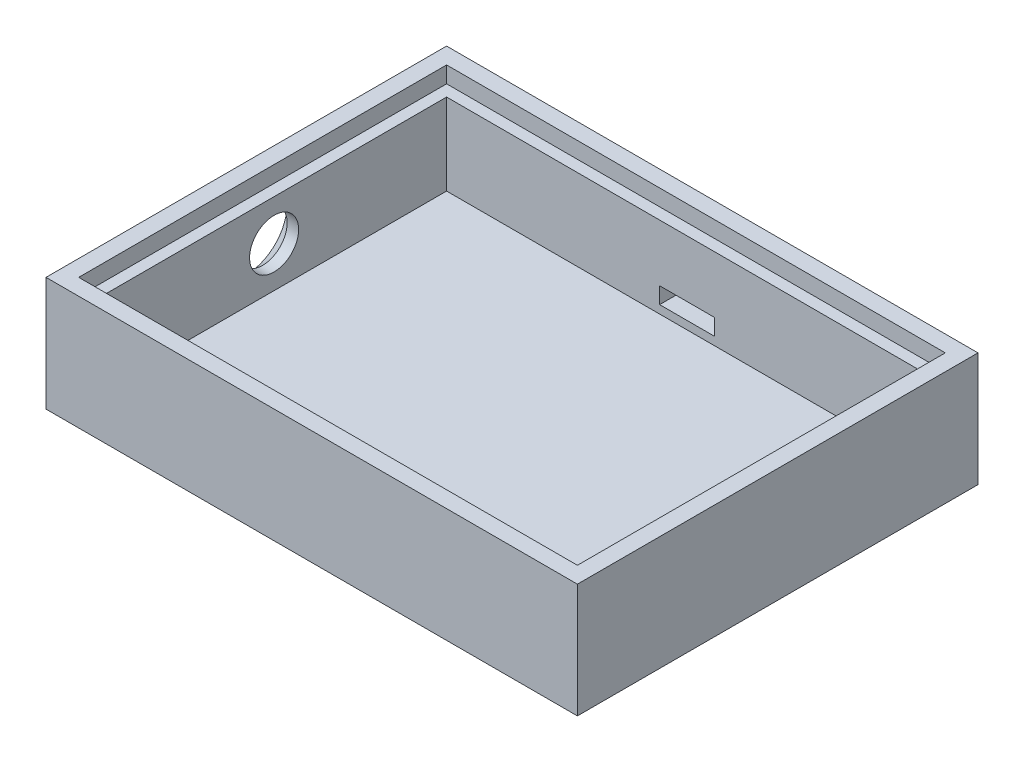
ISO-10303-21;
HEADER;
FILE_DESCRIPTION(('STEP AP214'),'2;1');
FILE_NAME('part.step','',(''),(''),'','','');
FILE_SCHEMA(('AUTOMOTIVE_DESIGN { 1 0 10303 214 1 1 1 1 }'));
ENDSEC;
DATA;
#1=APPLICATION_CONTEXT('core data for automotive mechanical design processes');
#2=APPLICATION_PROTOCOL_DEFINITION('international standard','automotive_design',2000,#1);
#3=PRODUCT_CONTEXT('',#1,'mechanical');
#4=PRODUCT('Part','Part','',(#3));
#5=PRODUCT_RELATED_PRODUCT_CATEGORY('part','',(#4));
#6=PRODUCT_DEFINITION_FORMATION('','',#4);
#7=PRODUCT_DEFINITION_CONTEXT('part definition',#1,'design');
#8=PRODUCT_DEFINITION('design','',#6,#7);
#9=PRODUCT_DEFINITION_SHAPE('','',#8);
#10=(LENGTH_UNIT() NAMED_UNIT(*) SI_UNIT(.MILLI.,.METRE.));
#11=(NAMED_UNIT(*) PLANE_ANGLE_UNIT() SI_UNIT($,.RADIAN.));
#12=(NAMED_UNIT(*) SI_UNIT($,.STERADIAN.) SOLID_ANGLE_UNIT());
#13=UNCERTAINTY_MEASURE_WITH_UNIT(LENGTH_MEASURE(1.E-05),#10,'distance_accuracy_value','');
#14=(GEOMETRIC_REPRESENTATION_CONTEXT(3) GLOBAL_UNCERTAINTY_ASSIGNED_CONTEXT((#13)) GLOBAL_UNIT_ASSIGNED_CONTEXT((#10,
#11,#12)) REPRESENTATION_CONTEXT('',''));
#15=CARTESIAN_POINT('',(0.,0.,0.));
#16=DIRECTION('',(0.,0.,1.));
#17=DIRECTION('',(1.,0.,0.));
#18=AXIS2_PLACEMENT_3D('',#15,#16,#17);
#19=CARTESIAN_POINT('',(-10.5,25.,-122.5));
#20=DIRECTION('',(-1.,0.,0.));
#21=DIRECTION('',(0.,-1.,0.));
#22=AXIS2_PLACEMENT_3D('',#19,#20,#21);
#23=PLANE('',#22);
#24=DIRECTION('',(0.,1.,0.));
#25=VECTOR('',#24,1.);
#26=CARTESIAN_POINT('',(-10.5,25.,-115.5));
#27=LINE('',#26,#25);
#28=CARTESIAN_POINT('',(-10.5,15.,-115.5));
#29=VERTEX_POINT('',#28);
#30=CARTESIAN_POINT('',(-10.5,25.,-115.5));
#31=VERTEX_POINT('',#30);
#32=EDGE_CURVE('E217',#29,#31,#27,.T.);
#33=ORIENTED_EDGE('',*,*,#32,.F.);
#34=DIRECTION('',(0.,0.,1.));
#35=VECTOR('',#34,1.);
#36=CARTESIAN_POINT('',(-10.5,15.,-122.5));
#37=LINE('',#36,#35);
#38=CARTESIAN_POINT('',(-10.5,15.,-122.5));
#39=VERTEX_POINT('',#38);
#40=EDGE_CURVE('E192',#39,#29,#37,.T.);
#41=ORIENTED_EDGE('',*,*,#40,.F.);
#42=DIRECTION('',(0.,-1.,0.));
#43=VECTOR('',#42,1.);
#44=CARTESIAN_POINT('',(-10.5,25.,-122.5));
#45=LINE('',#44,#43);
#46=CARTESIAN_POINT('',(-10.5,25.,-122.5));
#47=VERTEX_POINT('',#46);
#48=EDGE_CURVE('E220',#47,#39,#45,.T.);
#49=ORIENTED_EDGE('',*,*,#48,.F.);
#50=DIRECTION('',(0.,0.,1.));
#51=VECTOR('',#50,1.);
#52=CARTESIAN_POINT('',(-10.5,25.,-122.5));
#53=LINE('',#52,#51);
#54=EDGE_CURVE('E238',#47,#31,#53,.T.);
#55=ORIENTED_EDGE('',*,*,#54,.T.);
#56=EDGE_LOOP('',(#33,#41,#49,#55));
#57=FACE_BOUND('',#56,.T.);
#58=ADVANCED_FACE('F39',(#57),#23,.F.);
#59=CARTESIAN_POINT('',(13.5,25.,-122.5));
#60=DIRECTION('',(1.,0.,0.));
#61=DIRECTION('',(0.,1.,0.));
#62=AXIS2_PLACEMENT_3D('',#59,#60,#61);
#63=PLANE('',#62);
#64=DIRECTION('',(0.,-1.,0.));
#65=VECTOR('',#64,1.);
#66=CARTESIAN_POINT('',(13.5,25.,-115.5));
#67=LINE('',#66,#65);
#68=CARTESIAN_POINT('',(13.5,25.,-115.5));
#69=VERTEX_POINT('',#68);
#70=CARTESIAN_POINT('',(13.5,15.,-115.5));
#71=VERTEX_POINT('',#70);
#72=EDGE_CURVE('E210',#69,#71,#67,.T.);
#73=ORIENTED_EDGE('',*,*,#72,.F.);
#74=DIRECTION('',(0.,0.,1.));
#75=VECTOR('',#74,1.);
#76=CARTESIAN_POINT('',(13.5,25.,-122.5));
#77=LINE('',#76,#75);
#78=CARTESIAN_POINT('',(13.5,25.,-122.5));
#79=VERTEX_POINT('',#78);
#80=EDGE_CURVE('E243',#79,#69,#77,.T.);
#81=ORIENTED_EDGE('',*,*,#80,.F.);
#82=DIRECTION('',(0.,1.,0.));
#83=VECTOR('',#82,1.);
#84=CARTESIAN_POINT('',(13.5,25.,-122.5));
#85=LINE('',#84,#83);
#86=CARTESIAN_POINT('',(13.5,15.,-122.5));
#87=VERTEX_POINT('',#86);
#88=EDGE_CURVE('E228',#87,#79,#85,.T.);
#89=ORIENTED_EDGE('',*,*,#88,.F.);
#90=DIRECTION('',(0.,0.,1.));
#91=VECTOR('',#90,1.);
#92=CARTESIAN_POINT('',(13.5,15.,-122.5));
#93=LINE('',#92,#91);
#94=EDGE_CURVE('E246',#87,#71,#93,.T.);
#95=ORIENTED_EDGE('',*,*,#94,.T.);
#96=EDGE_LOOP('',(#73,#81,#89,#95));
#97=FACE_BOUND('',#96,.T.);
#98=ADVANCED_FACE('F369',(#97),#63,.F.);
#99=CARTESIAN_POINT('',(0.,59.8,0.));
#100=DIRECTION('',(0.,1.,0.));
#101=DIRECTION('',(0.,0.,1.));
#102=AXIS2_PLACEMENT_3D('',#99,#100,#101);
#103=PLANE('',#102);
#104=DIRECTION('',(0.,0.,1.));
#105=VECTOR('',#104,1.);
#106=CARTESIAN_POINT('',(-152.5,59.8,-112.5));
#107=LINE('',#106,#105);
#108=CARTESIAN_POINT('',(-152.5,59.8,-112.5));
#109=VERTEX_POINT('',#108);
#110=CARTESIAN_POINT('',(-152.5,59.8,112.5));
#111=VERTEX_POINT('',#110);
#112=EDGE_CURVE('E252',#109,#111,#107,.T.);
#113=ORIENTED_EDGE('',*,*,#112,.T.);
#114=DIRECTION('',(1.,0.,0.));
#115=VECTOR('',#114,1.);
#116=CARTESIAN_POINT('',(-152.5,59.8,112.5));
#117=LINE('',#116,#115);
#118=CARTESIAN_POINT('',(152.5,59.8,112.5));
#119=VERTEX_POINT('',#118);
#120=EDGE_CURVE('E266',#111,#119,#117,.T.);
#121=ORIENTED_EDGE('',*,*,#120,.T.);
#122=DIRECTION('',(0.,0.,-1.));
#123=VECTOR('',#122,1.);
#124=CARTESIAN_POINT('',(152.5,59.8,112.5));
#125=LINE('',#124,#123);
#126=CARTESIAN_POINT('',(152.5,59.8,-112.5));
#127=VERTEX_POINT('',#126);
#128=EDGE_CURVE('E268',#119,#127,#125,.T.);
#129=ORIENTED_EDGE('',*,*,#128,.T.);
#130=DIRECTION('',(-1.,0.,0.));
#131=VECTOR('',#130,1.);
#132=CARTESIAN_POINT('',(152.5,59.8,-112.5));
#133=LINE('',#132,#131);
#134=EDGE_CURVE('E256',#127,#109,#133,.T.);
#135=ORIENTED_EDGE('',*,*,#134,.T.);
#136=EDGE_LOOP('',(#113,#121,#129,#135));
#137=FACE_BOUND('',#136,.T.);
#138=DIRECTION('',(-1.,0.,0.));
#139=VECTOR('',#138,1.);
#140=CARTESIAN_POINT('',(145.5,59.8,-105.5));
#141=LINE('',#140,#139);
#142=CARTESIAN_POINT('',(145.5,59.8,-105.5));
#143=VERTEX_POINT('',#142);
#144=CARTESIAN_POINT('',(-145.5,59.8,-105.5));
#145=VERTEX_POINT('',#144);
#146=EDGE_CURVE('E299',#143,#145,#141,.T.);
#147=ORIENTED_EDGE('',*,*,#146,.F.);
#148=DIRECTION('',(0.,0.,-1.));
#149=VECTOR('',#148,1.);
#150=CARTESIAN_POINT('',(145.5,59.8,105.5));
#151=LINE('',#150,#149);
#152=CARTESIAN_POINT('',(145.5,59.8,105.5));
#153=VERTEX_POINT('',#152);
#154=EDGE_CURVE('E297',#153,#143,#151,.T.);
#155=ORIENTED_EDGE('',*,*,#154,.F.);
#156=DIRECTION('',(1.,0.,0.));
#157=VECTOR('',#156,1.);
#158=CARTESIAN_POINT('',(-145.5,59.8,105.5));
#159=LINE('',#158,#157);
#160=CARTESIAN_POINT('',(-145.5,59.8,105.5));
#161=VERTEX_POINT('',#160);
#162=EDGE_CURVE('E306',#161,#153,#159,.T.);
#163=ORIENTED_EDGE('',*,*,#162,.F.);
#164=DIRECTION('',(0.,0.,1.));
#165=VECTOR('',#164,1.);
#166=CARTESIAN_POINT('',(-145.5,59.8,-105.5));
#167=LINE('',#166,#165);
#168=EDGE_CURVE('E303',#145,#161,#167,.T.);
#169=ORIENTED_EDGE('',*,*,#168,.F.);
#170=EDGE_LOOP('',(#147,#155,#163,#169));
#171=FACE_BOUND('',#170,.T.);
#172=ADVANCED_FACE('F376',(#137,#171),#103,.T.);
#173=CARTESIAN_POINT('',(145.5,59.8,105.5));
#174=DIRECTION('',(-1.,0.,0.));
#175=DIRECTION('',(0.,0.,1.));
#176=AXIS2_PLACEMENT_3D('',#173,#174,#175);
#177=PLANE('',#176);
#178=DIRECTION('',(0.,0.,-1.));
#179=VECTOR('',#178,1.);
#180=CARTESIAN_POINT('',(145.5,10.,105.5));
#181=LINE('',#180,#179);
#182=CARTESIAN_POINT('',(145.5,10.,105.5));
#183=VERTEX_POINT('',#182);
#184=CARTESIAN_POINT('',(145.5,10.,-105.5));
#185=VERTEX_POINT('',#184);
#186=EDGE_CURVE('E296',#183,#185,#181,.T.);
#187=ORIENTED_EDGE('',*,*,#186,.F.);
#188=DIRECTION('',(0.,-1.,0.));
#189=VECTOR('',#188,1.);
#190=CARTESIAN_POINT('',(145.5,59.8,105.5));
#191=LINE('',#190,#189);
#192=EDGE_CURVE('E308',#153,#183,#191,.T.);
#193=ORIENTED_EDGE('',*,*,#192,.F.);
#194=ORIENTED_EDGE('',*,*,#154,.T.);
#195=DIRECTION('',(0.,-1.,0.));
#196=VECTOR('',#195,1.);
#197=CARTESIAN_POINT('',(145.5,59.8,-105.5));
#198=LINE('',#197,#196);
#199=EDGE_CURVE('E324',#143,#185,#198,.T.);
#200=ORIENTED_EDGE('',*,*,#199,.T.);
#201=EDGE_LOOP('',(#187,#193,#194,#200));
#202=FACE_BOUND('',#201,.T.);
#203=ADVANCED_FACE('F414',(#202),#177,.T.);
#204=CARTESIAN_POINT('',(145.5,59.8,-105.5));
#205=DIRECTION('',(0.,0.,1.));
#206=DIRECTION('',(1.,0.,0.));
#207=AXIS2_PLACEMENT_3D('',#204,#205,#206);
#208=PLANE('',#207);
#209=DIRECTION('',(0.,-1.,0.));
#210=VECTOR('',#209,1.);
#211=CARTESIAN_POINT('',(-15.1999999999999,25.,-105.5));
#212=LINE('',#211,#210);
#213=CARTESIAN_POINT('',(-15.1999999999999,25.,-105.5));
#214=VERTEX_POINT('',#213);
#215=CARTESIAN_POINT('',(-15.1999999999999,15.,-105.5));
#216=VERTEX_POINT('',#215);
#217=EDGE_CURVE('E185',#214,#216,#212,.T.);
#218=ORIENTED_EDGE('',*,*,#217,.F.);
#219=DIRECTION('',(-1.,0.,0.));
#220=VECTOR('',#219,1.);
#221=CARTESIAN_POINT('',(-10.5,25.,-105.5));
#222=LINE('',#221,#220);
#223=CARTESIAN_POINT('',(18.2,25.,-105.5));
#224=VERTEX_POINT('',#223);
#225=EDGE_CURVE('E225',#224,#214,#222,.T.);
#226=ORIENTED_EDGE('',*,*,#225,.F.);
#227=DIRECTION('',(0.,1.,0.));
#228=VECTOR('',#227,1.);
#229=CARTESIAN_POINT('',(18.2,25.,-105.5));
#230=LINE('',#229,#228);
#231=CARTESIAN_POINT('',(18.2,15.,-105.5));
#232=VERTEX_POINT('',#231);
#233=EDGE_CURVE('E200',#232,#224,#230,.T.);
#234=ORIENTED_EDGE('',*,*,#233,.F.);
#235=DIRECTION('',(1.,0.,0.));
#236=VECTOR('',#235,1.);
#237=CARTESIAN_POINT('',(-10.5,15.,-105.5));
#238=LINE('',#237,#236);
#239=EDGE_CURVE('E219',#216,#232,#238,.T.);
#240=ORIENTED_EDGE('',*,*,#239,.F.);
#241=EDGE_LOOP('',(#218,#226,#234,#240));
#242=FACE_BOUND('',#241,.T.);
#243=DIRECTION('',(-1.,0.,0.));
#244=VECTOR('',#243,1.);
#245=CARTESIAN_POINT('',(145.5,10.,-105.5));
#246=LINE('',#245,#244);
#247=CARTESIAN_POINT('',(-145.5,10.,-105.5));
#248=VERTEX_POINT('',#247);
#249=EDGE_CURVE('E310',#185,#248,#246,.T.);
#250=ORIENTED_EDGE('',*,*,#249,.F.);
#251=ORIENTED_EDGE('',*,*,#199,.F.);
#252=ORIENTED_EDGE('',*,*,#146,.T.);
#253=DIRECTION('',(0.,-1.,0.));
#254=VECTOR('',#253,1.);
#255=CARTESIAN_POINT('',(-145.5,59.8,-105.5));
#256=LINE('',#255,#254);
#257=EDGE_CURVE('E321',#145,#248,#256,.T.);
#258=ORIENTED_EDGE('',*,*,#257,.T.);
#259=EDGE_LOOP('',(#250,#251,#252,#258));
#260=FACE_BOUND('',#259,.T.);
#261=ADVANCED_FACE('F410',(#242,#260),#208,.T.);
#262=CARTESIAN_POINT('',(-145.5,59.8,-105.5));
#263=DIRECTION('',(1.,0.,0.));
#264=DIRECTION('',(0.,0.,-1.));
#265=AXIS2_PLACEMENT_3D('',#262,#263,#264);
#266=PLANE('',#265);
#267=CARTESIAN_POINT('',(-145.5,34.9,0.));
#268=DIRECTION('',(1.,0.,0.));
#269=DIRECTION('',(0.,0.,-1.));
#270=AXIS2_PLACEMENT_3D('',#267,#268,#269);
#271=CIRCLE('',#270,15.);
#272=CARTESIAN_POINT('',(-145.5,34.9,-15.));
#273=VERTEX_POINT('',#272);
#274=EDGE_CURVE('E242',#273,#273,#271,.T.);
#275=ORIENTED_EDGE('',*,*,#274,.F.);
#276=EDGE_LOOP('',(#275));
#277=FACE_BOUND('',#276,.T.);
#278=DIRECTION('',(0.,0.,1.));
#279=VECTOR('',#278,1.);
#280=CARTESIAN_POINT('',(-145.5,10.,-105.5));
#281=LINE('',#280,#279);
#282=CARTESIAN_POINT('',(-145.5,10.,105.5));
#283=VERTEX_POINT('',#282);
#284=EDGE_CURVE('E312',#248,#283,#281,.T.);
#285=ORIENTED_EDGE('',*,*,#284,.F.);
#286=ORIENTED_EDGE('',*,*,#257,.F.);
#287=ORIENTED_EDGE('',*,*,#168,.T.);
#288=DIRECTION('',(0.,-1.,0.));
#289=VECTOR('',#288,1.);
#290=CARTESIAN_POINT('',(-145.5,59.8,105.5));
#291=LINE('',#290,#289);
#292=EDGE_CURVE('E318',#161,#283,#291,.T.);
#293=ORIENTED_EDGE('',*,*,#292,.T.);
#294=EDGE_LOOP('',(#285,#286,#287,#293));
#295=FACE_BOUND('',#294,.T.);
#296=ADVANCED_FACE('F406',(#277,#295),#266,.T.);
#297=CARTESIAN_POINT('',(-145.5,59.8,105.5));
#298=DIRECTION('',(0.,0.,-1.));
#299=DIRECTION('',(-1.,0.,0.));
#300=AXIS2_PLACEMENT_3D('',#297,#298,#299);
#301=PLANE('',#300);
#302=DIRECTION('',(1.,0.,0.));
#303=VECTOR('',#302,1.);
#304=CARTESIAN_POINT('',(-145.5,10.,105.5));
#305=LINE('',#304,#303);
#306=EDGE_CURVE('E300',#283,#183,#305,.T.);
#307=ORIENTED_EDGE('',*,*,#306,.F.);
#308=ORIENTED_EDGE('',*,*,#292,.F.);
#309=ORIENTED_EDGE('',*,*,#162,.T.);
#310=ORIENTED_EDGE('',*,*,#192,.T.);
#311=EDGE_LOOP('',(#307,#308,#309,#310));
#312=FACE_BOUND('',#311,.T.);
#313=ADVANCED_FACE('F403',(#312),#301,.T.);
#314=CARTESIAN_POINT('',(0.,10.,0.));
#315=DIRECTION('',(0.,1.,0.));
#316=DIRECTION('',(0.,0.,1.));
#317=AXIS2_PLACEMENT_3D('',#314,#315,#316);
#318=PLANE('',#317);
#319=ORIENTED_EDGE('',*,*,#186,.T.);
#320=ORIENTED_EDGE('',*,*,#249,.T.);
#321=ORIENTED_EDGE('',*,*,#284,.T.);
#322=ORIENTED_EDGE('',*,*,#306,.T.);
#323=EDGE_LOOP('',(#319,#320,#321,#322));
#324=FACE_BOUND('',#323,.T.);
#325=ADVANCED_FACE('F401',(#324),#318,.T.);
#326=CARTESIAN_POINT('',(0.,69.8,0.));
#327=DIRECTION('',(0.,1.,0.));
#328=DIRECTION('',(0.,0.,1.));
#329=AXIS2_PLACEMENT_3D('',#326,#327,#328);
#330=PLANE('',#329);
#331=DIRECTION('',(0.,0.,1.));
#332=VECTOR('',#331,1.);
#333=CARTESIAN_POINT('',(-162.5,69.8,-122.5));
#334=LINE('',#333,#332);
#335=CARTESIAN_POINT('',(-162.5,69.8,-122.5));
#336=VERTEX_POINT('',#335);
#337=CARTESIAN_POINT('',(-162.5,69.8,122.5));
#338=VERTEX_POINT('',#337);
#339=EDGE_CURVE('E283',#336,#338,#334,.T.);
#340=ORIENTED_EDGE('',*,*,#339,.T.);
#341=DIRECTION('',(1.,0.,0.));
#342=VECTOR('',#341,1.);
#343=CARTESIAN_POINT('',(-162.5,69.8,122.5));
#344=LINE('',#343,#342);
#345=CARTESIAN_POINT('',(162.5,69.8,122.5));
#346=VERTEX_POINT('',#345);
#347=EDGE_CURVE('E286',#338,#346,#344,.T.);
#348=ORIENTED_EDGE('',*,*,#347,.T.);
#349=DIRECTION('',(0.,0.,-1.));
#350=VECTOR('',#349,1.);
#351=CARTESIAN_POINT('',(162.5,69.8,122.5));
#352=LINE('',#351,#350);
#353=CARTESIAN_POINT('',(162.5,69.8,-122.5));
#354=VERTEX_POINT('',#353);
#355=EDGE_CURVE('E289',#346,#354,#352,.T.);
#356=ORIENTED_EDGE('',*,*,#355,.T.);
#357=DIRECTION('',(-1.,0.,0.));
#358=VECTOR('',#357,1.);
#359=CARTESIAN_POINT('',(162.5,69.8,-122.5));
#360=LINE('',#359,#358);
#361=EDGE_CURVE('E292',#354,#336,#360,.T.);
#362=ORIENTED_EDGE('',*,*,#361,.T.);
#363=EDGE_LOOP('',(#340,#348,#356,#362));
#364=FACE_BOUND('',#363,.T.);
#365=DIRECTION('',(1.,0.,0.));
#366=VECTOR('',#365,1.);
#367=CARTESIAN_POINT('',(-152.5,69.8,112.5));
#368=LINE('',#367,#366);
#369=CARTESIAN_POINT('',(-152.5,69.8,112.5));
#370=VERTEX_POINT('',#369);
#371=CARTESIAN_POINT('',(152.5,69.8,112.5));
#372=VERTEX_POINT('',#371);
#373=EDGE_CURVE('E255',#370,#372,#368,.T.);
#374=ORIENTED_EDGE('',*,*,#373,.F.);
#375=DIRECTION('',(0.,0.,1.));
#376=VECTOR('',#375,1.);
#377=CARTESIAN_POINT('',(-152.5,69.8,-112.5));
#378=LINE('',#377,#376);
#379=CARTESIAN_POINT('',(-152.5,69.8,-112.5));
#380=VERTEX_POINT('',#379);
#381=EDGE_CURVE('E253',#380,#370,#378,.T.);
#382=ORIENTED_EDGE('',*,*,#381,.F.);
#383=DIRECTION('',(-1.,0.,0.));
#384=VECTOR('',#383,1.);
#385=CARTESIAN_POINT('',(152.5,69.8,-112.5));
#386=LINE('',#385,#384);
#387=CARTESIAN_POINT('',(152.5,69.8,-112.5));
#388=VERTEX_POINT('',#387);
#389=EDGE_CURVE('E261',#388,#380,#386,.T.);
#390=ORIENTED_EDGE('',*,*,#389,.F.);
#391=DIRECTION('',(0.,0.,-1.));
#392=VECTOR('',#391,1.);
#393=CARTESIAN_POINT('',(152.5,69.8,112.5));
#394=LINE('',#393,#392);
#395=EDGE_CURVE('E258',#372,#388,#394,.T.);
#396=ORIENTED_EDGE('',*,*,#395,.F.);
#397=EDGE_LOOP('',(#374,#382,#390,#396));
#398=FACE_BOUND('',#397,.T.);
#399=ADVANCED_FACE('F397',(#364,#398),#330,.T.);
#400=CARTESIAN_POINT('',(-152.5,69.8,-112.5));
#401=DIRECTION('',(1.,0.,0.));
#402=DIRECTION('',(0.,0.,-1.));
#403=AXIS2_PLACEMENT_3D('',#400,#401,#402);
#404=PLANE('',#403);
#405=ORIENTED_EDGE('',*,*,#112,.F.);
#406=DIRECTION('',(0.,-1.,0.));
#407=VECTOR('',#406,1.);
#408=CARTESIAN_POINT('',(-152.5,69.8,-112.5));
#409=LINE('',#408,#407);
#410=EDGE_CURVE('E264',#380,#109,#409,.T.);
#411=ORIENTED_EDGE('',*,*,#410,.F.);
#412=ORIENTED_EDGE('',*,*,#381,.T.);
#413=DIRECTION('',(0.,-1.,0.));
#414=VECTOR('',#413,1.);
#415=CARTESIAN_POINT('',(-152.5,69.8,112.5));
#416=LINE('',#415,#414);
#417=EDGE_CURVE('E280',#370,#111,#416,.T.);
#418=ORIENTED_EDGE('',*,*,#417,.T.);
#419=EDGE_LOOP('',(#405,#411,#412,#418));
#420=FACE_BOUND('',#419,.T.);
#421=ADVANCED_FACE('F393',(#420),#404,.T.);
#422=CARTESIAN_POINT('',(-152.5,69.8,112.5));
#423=DIRECTION('',(0.,0.,-1.));
#424=DIRECTION('',(-1.,0.,0.));
#425=AXIS2_PLACEMENT_3D('',#422,#423,#424);
#426=PLANE('',#425);
#427=ORIENTED_EDGE('',*,*,#120,.F.);
#428=ORIENTED_EDGE('',*,*,#417,.F.);
#429=ORIENTED_EDGE('',*,*,#373,.T.);
#430=DIRECTION('',(0.,-1.,0.));
#431=VECTOR('',#430,1.);
#432=CARTESIAN_POINT('',(152.5,69.8,112.5));
#433=LINE('',#432,#431);
#434=EDGE_CURVE('E277',#372,#119,#433,.T.);
#435=ORIENTED_EDGE('',*,*,#434,.T.);
#436=EDGE_LOOP('',(#427,#428,#429,#435));
#437=FACE_BOUND('',#436,.T.);
#438=ADVANCED_FACE('F389',(#437),#426,.T.);
#439=CARTESIAN_POINT('',(152.5,69.8,112.5));
#440=DIRECTION('',(-1.,0.,0.));
#441=DIRECTION('',(0.,0.,1.));
#442=AXIS2_PLACEMENT_3D('',#439,#440,#441);
#443=PLANE('',#442);
#444=ORIENTED_EDGE('',*,*,#128,.F.);
#445=ORIENTED_EDGE('',*,*,#434,.F.);
#446=ORIENTED_EDGE('',*,*,#395,.T.);
#447=DIRECTION('',(0.,-1.,0.));
#448=VECTOR('',#447,1.);
#449=CARTESIAN_POINT('',(152.5,69.8,-112.5));
#450=LINE('',#449,#448);
#451=EDGE_CURVE('E274',#388,#127,#450,.T.);
#452=ORIENTED_EDGE('',*,*,#451,.T.);
#453=EDGE_LOOP('',(#444,#445,#446,#452));
#454=FACE_BOUND('',#453,.T.);
#455=ADVANCED_FACE('F385',(#454),#443,.T.);
#456=CARTESIAN_POINT('',(152.5,69.8,-112.5));
#457=DIRECTION('',(0.,0.,1.));
#458=DIRECTION('',(1.,0.,0.));
#459=AXIS2_PLACEMENT_3D('',#456,#457,#458);
#460=PLANE('',#459);
#461=ORIENTED_EDGE('',*,*,#134,.F.);
#462=ORIENTED_EDGE('',*,*,#451,.F.);
#463=ORIENTED_EDGE('',*,*,#389,.T.);
#464=ORIENTED_EDGE('',*,*,#410,.T.);
#465=EDGE_LOOP('',(#461,#462,#463,#464));
#466=FACE_BOUND('',#465,.T.);
#467=ADVANCED_FACE('F381',(#466),#460,.T.);
#468=CARTESIAN_POINT('',(0.,0.,0.));
#469=DIRECTION('',(0.,1.,0.));
#470=DIRECTION('',(0.,0.,1.));
#471=AXIS2_PLACEMENT_3D('',#468,#469,#470);
#472=PLANE('',#471);
#473=DIRECTION('',(0.,0.,1.));
#474=VECTOR('',#473,1.);
#475=CARTESIAN_POINT('',(-162.5,0.,-122.5));
#476=LINE('',#475,#474);
#477=CARTESIAN_POINT('',(-162.5,0.,-122.5));
#478=VERTEX_POINT('',#477);
#479=CARTESIAN_POINT('',(-162.5,0.,122.5));
#480=VERTEX_POINT('',#479);
#481=EDGE_CURVE('E327',#478,#480,#476,.T.);
#482=ORIENTED_EDGE('',*,*,#481,.F.);
#483=DIRECTION('',(-1.,0.,0.));
#484=VECTOR('',#483,1.);
#485=CARTESIAN_POINT('',(-162.5,0.,-122.5));
#486=LINE('',#485,#484);
#487=CARTESIAN_POINT('',(162.5,0.,-122.5));
#488=VERTEX_POINT('',#487);
#489=EDGE_CURVE('E335',#488,#478,#486,.T.);
#490=ORIENTED_EDGE('',*,*,#489,.F.);
#491=DIRECTION('',(0.,0.,-1.));
#492=VECTOR('',#491,1.);
#493=CARTESIAN_POINT('',(162.5,0.,-122.5));
#494=LINE('',#493,#492);
#495=CARTESIAN_POINT('',(162.5,0.,122.5));
#496=VERTEX_POINT('',#495);
#497=EDGE_CURVE('E333',#496,#488,#494,.T.);
#498=ORIENTED_EDGE('',*,*,#497,.F.);
#499=DIRECTION('',(1.,0.,0.));
#500=VECTOR('',#499,1.);
#501=CARTESIAN_POINT('',(-162.5,0.,122.5));
#502=LINE('',#501,#500);
#503=EDGE_CURVE('E330',#480,#496,#502,.T.);
#504=ORIENTED_EDGE('',*,*,#503,.F.);
#505=EDGE_LOOP('',(#482,#490,#498,#504));
#506=FACE_BOUND('',#505,.T.);
#507=ADVANCED_FACE('F384',(#506),#472,.F.);
#508=CARTESIAN_POINT('',(-162.5,10.,-122.5));
#509=DIRECTION('',(0.,0.,1.));
#510=DIRECTION('',(1.,0.,0.));
#511=AXIS2_PLACEMENT_3D('',#508,#509,#510);
#512=PLANE('',#511);
#513=DIRECTION('',(-1.,0.,0.));
#514=VECTOR('',#513,1.);
#515=CARTESIAN_POINT('',(-10.5,25.,-122.5));
#516=LINE('',#515,#514);
#517=EDGE_CURVE('E231',#79,#47,#516,.T.);
#518=ORIENTED_EDGE('',*,*,#517,.T.);
#519=ORIENTED_EDGE('',*,*,#48,.T.);
#520=DIRECTION('',(1.,0.,0.));
#521=VECTOR('',#520,1.);
#522=CARTESIAN_POINT('',(-10.5,15.,-122.5));
#523=LINE('',#522,#521);
#524=EDGE_CURVE('E224',#39,#87,#523,.T.);
#525=ORIENTED_EDGE('',*,*,#524,.T.);
#526=ORIENTED_EDGE('',*,*,#88,.T.);
#527=EDGE_LOOP('',(#518,#519,#525,#526));
#528=FACE_BOUND('',#527,.T.);
#529=ORIENTED_EDGE('',*,*,#489,.T.);
#530=DIRECTION('',(0.,-1.,0.));
#531=VECTOR('',#530,1.);
#532=CARTESIAN_POINT('',(-162.5,10.,-122.5));
#533=LINE('',#532,#531);
#534=EDGE_CURVE('E337',#336,#478,#533,.T.);
#535=ORIENTED_EDGE('',*,*,#534,.F.);
#536=ORIENTED_EDGE('',*,*,#361,.F.);
#537=DIRECTION('',(0.,-1.,0.));
#538=VECTOR('',#537,1.);
#539=CARTESIAN_POINT('',(162.5,10.,-122.5));
#540=LINE('',#539,#538);
#541=EDGE_CURVE('E340',#354,#488,#540,.T.);
#542=ORIENTED_EDGE('',*,*,#541,.T.);
#543=EDGE_LOOP('',(#529,#535,#536,#542));
#544=FACE_BOUND('',#543,.T.);
#545=ADVANCED_FACE('F427',(#528,#544),#512,.F.);
#546=CARTESIAN_POINT('',(162.5,10.,-122.5));
#547=DIRECTION('',(-1.,0.,0.));
#548=DIRECTION('',(0.,0.,1.));
#549=AXIS2_PLACEMENT_3D('',#546,#547,#548);
#550=PLANE('',#549);
#551=ORIENTED_EDGE('',*,*,#497,.T.);
#552=ORIENTED_EDGE('',*,*,#541,.F.);
#553=ORIENTED_EDGE('',*,*,#355,.F.);
#554=DIRECTION('',(0.,-1.,0.));
#555=VECTOR('',#554,1.);
#556=CARTESIAN_POINT('',(162.5,10.,122.5));
#557=LINE('',#556,#555);
#558=EDGE_CURVE('E343',#346,#496,#557,.T.);
#559=ORIENTED_EDGE('',*,*,#558,.T.);
#560=EDGE_LOOP('',(#551,#552,#553,#559));
#561=FACE_BOUND('',#560,.T.);
#562=ADVANCED_FACE('F431',(#561),#550,.F.);
#563=CARTESIAN_POINT('',(-162.5,10.,122.5));
#564=DIRECTION('',(0.,0.,-1.));
#565=DIRECTION('',(-1.,0.,0.));
#566=AXIS2_PLACEMENT_3D('',#563,#564,#565);
#567=PLANE('',#566);
#568=ORIENTED_EDGE('',*,*,#503,.T.);
#569=ORIENTED_EDGE('',*,*,#558,.F.);
#570=ORIENTED_EDGE('',*,*,#347,.F.);
#571=DIRECTION('',(0.,-1.,0.));
#572=VECTOR('',#571,1.);
#573=CARTESIAN_POINT('',(-162.5,10.,122.5));
#574=LINE('',#573,#572);
#575=EDGE_CURVE('E346',#338,#480,#574,.T.);
#576=ORIENTED_EDGE('',*,*,#575,.T.);
#577=EDGE_LOOP('',(#568,#569,#570,#576));
#578=FACE_BOUND('',#577,.T.);
#579=ADVANCED_FACE('F435',(#578),#567,.F.);
#580=CARTESIAN_POINT('',(-162.5,10.,-122.5));
#581=DIRECTION('',(1.,0.,0.));
#582=DIRECTION('',(0.,0.,-1.));
#583=AXIS2_PLACEMENT_3D('',#580,#581,#582);
#584=PLANE('',#583);
#585=CARTESIAN_POINT('',(-162.5,34.9,0.));
#586=DIRECTION('',(1.,0.,0.));
#587=DIRECTION('',(0.,0.,-1.));
#588=AXIS2_PLACEMENT_3D('',#585,#586,#587);
#589=CIRCLE('',#588,25.0000000000001);
#590=CARTESIAN_POINT('',(-162.5,34.9,-25.0000000000002));
#591=VERTEX_POINT('',#590);
#592=EDGE_CURVE('E11',#591,#591,#589,.T.);
#593=ORIENTED_EDGE('',*,*,#592,.T.);
#594=EDGE_LOOP('',(#593));
#595=FACE_BOUND('',#594,.T.);
#596=ORIENTED_EDGE('',*,*,#481,.T.);
#597=ORIENTED_EDGE('',*,*,#575,.F.);
#598=ORIENTED_EDGE('',*,*,#339,.F.);
#599=ORIENTED_EDGE('',*,*,#534,.T.);
#600=EDGE_LOOP('',(#596,#597,#598,#599));
#601=FACE_BOUND('',#600,.T.);
#602=ADVANCED_FACE('F365',(#595,#601),#584,.F.);
#603=CARTESIAN_POINT('',(-132.5,34.9,0.));
#604=DIRECTION('',(-1.,0.,0.));
#605=DIRECTION('',(0.,0.,1.));
#606=AXIS2_PLACEMENT_3D('',#603,#604,#605);
#607=CYLINDRICAL_SURFACE('',#606,15.);
#608=CARTESIAN_POINT('',(-152.5,34.9,0.));
#609=DIRECTION('',(1.,0.,0.));
#610=DIRECTION('',(0.,0.,-1.));
#611=AXIS2_PLACEMENT_3D('',#608,#609,#610);
#612=CIRCLE('',#611,15.);
#613=CARTESIAN_POINT('',(-152.5,34.9,-15.));
#614=VERTEX_POINT('',#613);
#615=EDGE_CURVE('E47',#614,#614,#612,.F.);
#616=ORIENTED_EDGE('',*,*,#615,.T.);
#617=EDGE_LOOP('',(#616));
#618=FACE_BOUND('',#617,.T.);
#619=ORIENTED_EDGE('',*,*,#274,.T.);
#620=EDGE_LOOP('',(#619));
#621=FACE_BOUND('',#620,.T.);
#622=ADVANCED_FACE('F351',(#618,#621),#607,.F.);
#623=CARTESIAN_POINT('',(-152.5,34.9,0.));
#624=DIRECTION('',(-1.,0.,0.));
#625=DIRECTION('',(0.,0.,1.));
#626=AXIS2_PLACEMENT_3D('',#623,#624,#625);
#627=CONICAL_SURFACE('',#626,15.,0.785398163397449);
#628=ORIENTED_EDGE('',*,*,#592,.F.);
#629=EDGE_LOOP('',(#628));
#630=FACE_BOUND('',#629,.T.);
#631=ORIENTED_EDGE('',*,*,#615,.F.);
#632=EDGE_LOOP('',(#631));
#633=FACE_BOUND('',#632,.T.);
#634=ADVANCED_FACE('F41',(#630,#633),#627,.F.);
#635=CARTESIAN_POINT('',(-10.5,25.,-122.5));
#636=DIRECTION('',(0.,1.,0.));
#637=DIRECTION('',(-1.,0.,0.));
#638=AXIS2_PLACEMENT_3D('',#635,#636,#637);
#639=PLANE('',#638);
#640=ORIENTED_EDGE('',*,*,#225,.T.);
#641=DIRECTION('',(0.,0.,1.));
#642=VECTOR('',#641,1.);
#643=CARTESIAN_POINT('',(-15.1999999999999,25.,-115.5));
#644=LINE('',#643,#642);
#645=CARTESIAN_POINT('',(-15.1999999999999,25.,-115.5));
#646=VERTEX_POINT('',#645);
#647=EDGE_CURVE('E208',#646,#214,#644,.T.);
#648=ORIENTED_EDGE('',*,*,#647,.F.);
#649=DIRECTION('',(-1.,0.,0.));
#650=VECTOR('',#649,1.);
#651=CARTESIAN_POINT('',(-15.1999999999999,25.,-115.5));
#652=LINE('',#651,#650);
#653=EDGE_CURVE('E198',#31,#646,#652,.T.);
#654=ORIENTED_EDGE('',*,*,#653,.F.);
#655=ORIENTED_EDGE('',*,*,#54,.F.);
#656=ORIENTED_EDGE('',*,*,#517,.F.);
#657=ORIENTED_EDGE('',*,*,#80,.T.);
#658=CARTESIAN_POINT('',(18.2,25.,-115.5));
#659=VERTEX_POINT('',#658);
#660=EDGE_CURVE('E54',#659,#69,#652,.T.);
#661=ORIENTED_EDGE('',*,*,#660,.F.);
#662=DIRECTION('',(0.,0.,1.));
#663=VECTOR('',#662,1.);
#664=CARTESIAN_POINT('',(18.2,25.,-115.5));
#665=LINE('',#664,#663);
#666=EDGE_CURVE('E211',#659,#224,#665,.T.);
#667=ORIENTED_EDGE('',*,*,#666,.T.);
#668=EDGE_LOOP('',(#640,#648,#654,#655,#656,#657,#661,#667));
#669=FACE_BOUND('',#668,.T.);
#670=ADVANCED_FACE('F355',(#669),#639,.F.);
#671=CARTESIAN_POINT('',(-10.5,15.,-122.5));
#672=DIRECTION('',(0.,-1.,0.));
#673=DIRECTION('',(0.,0.,-1.));
#674=AXIS2_PLACEMENT_3D('',#671,#672,#673);
#675=PLANE('',#674);
#676=ORIENTED_EDGE('',*,*,#239,.T.);
#677=DIRECTION('',(0.,0.,1.));
#678=VECTOR('',#677,1.);
#679=CARTESIAN_POINT('',(18.2,15.,-115.5));
#680=LINE('',#679,#678);
#681=CARTESIAN_POINT('',(18.2,15.,-115.5));
#682=VERTEX_POINT('',#681);
#683=EDGE_CURVE('E187',#682,#232,#680,.T.);
#684=ORIENTED_EDGE('',*,*,#683,.F.);
#685=DIRECTION('',(1.,0.,0.));
#686=VECTOR('',#685,1.);
#687=CARTESIAN_POINT('',(-15.1999999999999,15.,-115.5));
#688=LINE('',#687,#686);
#689=EDGE_CURVE('E194',#71,#682,#688,.T.);
#690=ORIENTED_EDGE('',*,*,#689,.F.);
#691=ORIENTED_EDGE('',*,*,#94,.F.);
#692=ORIENTED_EDGE('',*,*,#524,.F.);
#693=ORIENTED_EDGE('',*,*,#40,.T.);
#694=CARTESIAN_POINT('',(-15.1999999999999,15.,-115.5));
#695=VERTEX_POINT('',#694);
#696=EDGE_CURVE('E62',#695,#29,#688,.T.);
#697=ORIENTED_EDGE('',*,*,#696,.F.);
#698=DIRECTION('',(0.,0.,1.));
#699=VECTOR('',#698,1.);
#700=CARTESIAN_POINT('',(-15.1999999999999,15.,-115.5));
#701=LINE('',#700,#699);
#702=EDGE_CURVE('E180',#695,#216,#701,.T.);
#703=ORIENTED_EDGE('',*,*,#702,.T.);
#704=EDGE_LOOP('',(#676,#684,#690,#691,#692,#693,#697,#703));
#705=FACE_BOUND('',#704,.T.);
#706=ADVANCED_FACE('F190',(#705),#675,.F.);
#707=CARTESIAN_POINT('',(0.,0.,-115.5));
#708=DIRECTION('',(0.,0.,1.));
#709=DIRECTION('',(1.,0.,0.));
#710=AXIS2_PLACEMENT_3D('',#707,#708,#709);
#711=PLANE('',#710);
#712=ORIENTED_EDGE('',*,*,#72,.T.);
#713=ORIENTED_EDGE('',*,*,#689,.T.);
#714=DIRECTION('',(0.,1.,0.));
#715=VECTOR('',#714,1.);
#716=CARTESIAN_POINT('',(18.2,25.,-115.5));
#717=LINE('',#716,#715);
#718=EDGE_CURVE('E193',#682,#659,#717,.T.);
#719=ORIENTED_EDGE('',*,*,#718,.T.);
#720=ORIENTED_EDGE('',*,*,#660,.T.);
#721=EDGE_LOOP('',(#712,#713,#719,#720));
#722=FACE_BOUND('',#721,.T.);
#723=ADVANCED_FACE('F628',(#722),#711,.T.);
#724=CARTESIAN_POINT('',(18.2,25.,-115.5));
#725=DIRECTION('',(1.,0.,0.));
#726=DIRECTION('',(0.,0.,-1.));
#727=AXIS2_PLACEMENT_3D('',#724,#725,#726);
#728=PLANE('',#727);
#729=ORIENTED_EDGE('',*,*,#233,.T.);
#730=ORIENTED_EDGE('',*,*,#666,.F.);
#731=ORIENTED_EDGE('',*,*,#718,.F.);
#732=ORIENTED_EDGE('',*,*,#683,.T.);
#733=EDGE_LOOP('',(#729,#730,#731,#732));
#734=FACE_BOUND('',#733,.T.);
#735=ADVANCED_FACE('F637',(#734),#728,.F.);
#736=ORIENTED_EDGE('',*,*,#32,.T.);
#737=ORIENTED_EDGE('',*,*,#653,.T.);
#738=DIRECTION('',(0.,-1.,0.));
#739=VECTOR('',#738,1.);
#740=CARTESIAN_POINT('',(-15.1999999999999,25.,-115.5));
#741=LINE('',#740,#739);
#742=EDGE_CURVE('E183',#646,#695,#741,.T.);
#743=ORIENTED_EDGE('',*,*,#742,.T.);
#744=ORIENTED_EDGE('',*,*,#696,.T.);
#745=EDGE_LOOP('',(#736,#737,#743,#744));
#746=FACE_BOUND('',#745,.T.);
#747=ADVANCED_FACE('F196',(#746),#711,.T.);
#748=CARTESIAN_POINT('',(-15.1999999999999,25.,-115.5));
#749=DIRECTION('',(-1.,0.,0.));
#750=DIRECTION('',(0.,0.,1.));
#751=AXIS2_PLACEMENT_3D('',#748,#749,#750);
#752=PLANE('',#751);
#753=ORIENTED_EDGE('',*,*,#217,.T.);
#754=ORIENTED_EDGE('',*,*,#702,.F.);
#755=ORIENTED_EDGE('',*,*,#742,.F.);
#756=ORIENTED_EDGE('',*,*,#647,.T.);
#757=EDGE_LOOP('',(#753,#754,#755,#756));
#758=FACE_BOUND('',#757,.T.);
#759=ADVANCED_FACE('F181',(#758),#752,.F.);
#760=CLOSED_SHELL('',(#58,#98,#172,#203,#261,#296,#313,#325,#399,#421,#438,#455,#467,#507,#545,
#562,#579,#602,#622,#634,#670,#706,#723,#735,#747,#759));
#761=MANIFOLD_SOLID_BREP('B2',#760);
#762=ADVANCED_BREP_SHAPE_REPRESENTATION('',(#18,#761),#14);
#763=SHAPE_DEFINITION_REPRESENTATION(#9,#762);
ENDSEC;
END-ISO-10303-21;
